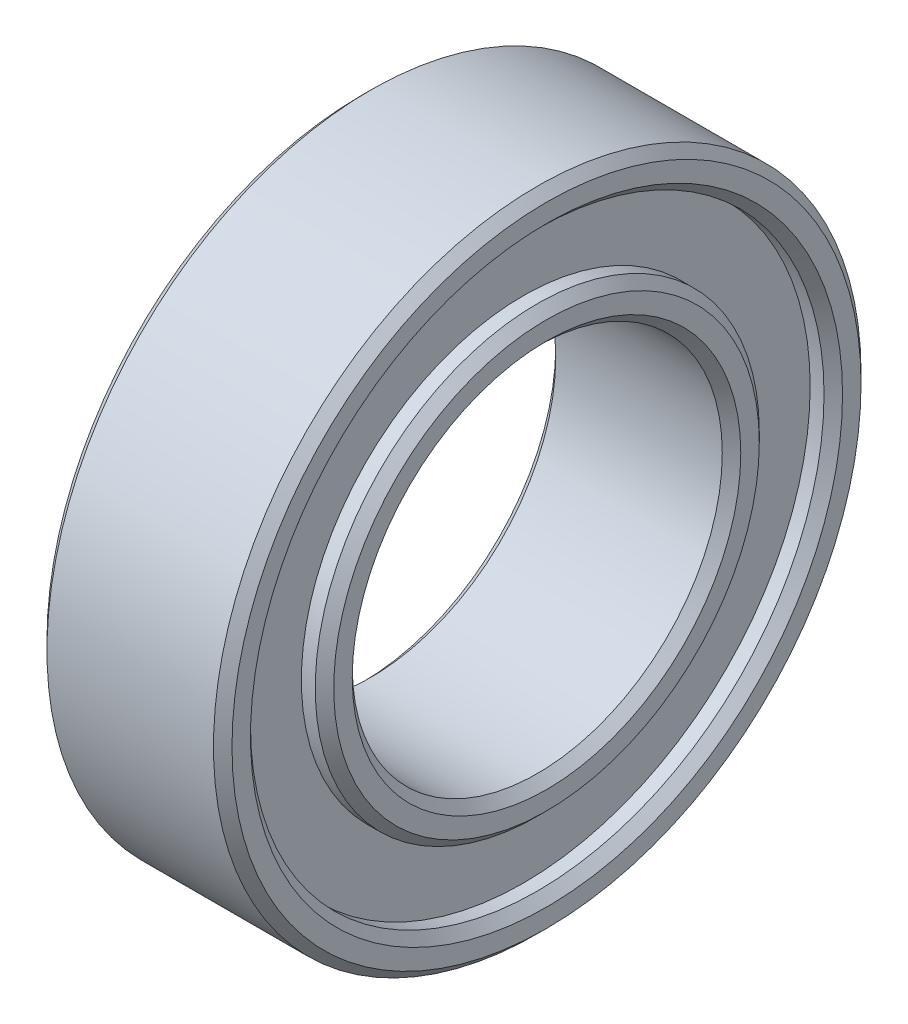
ISO-10303-21;
HEADER;
FILE_DESCRIPTION(('STEP AP214'),'2;1');
FILE_NAME('part.step','',(''),(''),'','','');
FILE_SCHEMA(('AUTOMOTIVE_DESIGN { 1 0 10303 214 1 1 1 1 }'));
ENDSEC;
DATA;
#1=APPLICATION_CONTEXT('core data for automotive mechanical design processes');
#2=APPLICATION_PROTOCOL_DEFINITION('international standard','automotive_design',2000,#1);
#3=PRODUCT_CONTEXT('',#1,'mechanical');
#4=PRODUCT('Part','Part','',(#3));
#5=PRODUCT_RELATED_PRODUCT_CATEGORY('part','',(#4));
#6=PRODUCT_DEFINITION_FORMATION('','',#4);
#7=PRODUCT_DEFINITION_CONTEXT('part definition',#1,'design');
#8=PRODUCT_DEFINITION('design','',#6,#7);
#9=PRODUCT_DEFINITION_SHAPE('','',#8);
#10=(LENGTH_UNIT() NAMED_UNIT(*) SI_UNIT(.MILLI.,.METRE.));
#11=(NAMED_UNIT(*) PLANE_ANGLE_UNIT() SI_UNIT($,.RADIAN.));
#12=(NAMED_UNIT(*) SI_UNIT($,.STERADIAN.) SOLID_ANGLE_UNIT());
#13=UNCERTAINTY_MEASURE_WITH_UNIT(LENGTH_MEASURE(1.E-05),#10,'distance_accuracy_value','');
#14=(GEOMETRIC_REPRESENTATION_CONTEXT(3) GLOBAL_UNCERTAINTY_ASSIGNED_CONTEXT((#13)) GLOBAL_UNIT_ASSIGNED_CONTEXT((#10,
#11,#12)) REPRESENTATION_CONTEXT('',''));
#15=CARTESIAN_POINT('',(0.,0.,0.));
#16=DIRECTION('',(0.,0.,1.));
#17=DIRECTION('',(1.,0.,0.));
#18=AXIS2_PLACEMENT_3D('',#15,#16,#17);
#19=CARTESIAN_POINT('',(-2.,0.,0.));
#20=DIRECTION('',(1.,0.,0.));
#21=DIRECTION('',(0.,0.,-1.));
#22=AXIS2_PLACEMENT_3D('',#19,#20,#21);
#23=PLANE('',#22);
#24=CARTESIAN_POINT('',(-2.,0.,0.));
#25=DIRECTION('',(1.,0.,0.));
#26=DIRECTION('',(0.,0.,-1.));
#27=AXIS2_PLACEMENT_3D('',#24,#25,#26);
#28=CIRCLE('',#27,4.6);
#29=CARTESIAN_POINT('',(-2.,0.,-4.6));
#30=VERTEX_POINT('',#29);
#31=EDGE_CURVE('E102',#30,#30,#28,.F.);
#32=ORIENTED_EDGE('',*,*,#31,.T.);
#33=EDGE_LOOP('',(#32));
#34=FACE_BOUND('',#33,.T.);
#35=CARTESIAN_POINT('',(-2.,0.,0.));
#36=DIRECTION('',(1.,0.,0.));
#37=DIRECTION('',(0.,0.,-1.));
#38=AXIS2_PLACEMENT_3D('',#35,#36,#37);
#39=CIRCLE('',#38,4.2);
#40=CARTESIAN_POINT('',(-2.,0.,-4.2));
#41=VERTEX_POINT('',#40);
#42=EDGE_CURVE('E106',#41,#41,#39,.T.);
#43=ORIENTED_EDGE('',*,*,#42,.T.);
#44=EDGE_LOOP('',(#43));
#45=FACE_BOUND('',#44,.T.);
#46=ADVANCED_FACE('F41',(#34,#45),#23,.F.);
#47=CARTESIAN_POINT('',(2.,0.,0.));
#48=DIRECTION('',(1.,0.,0.));
#49=DIRECTION('',(0.,0.,-1.));
#50=AXIS2_PLACEMENT_3D('',#47,#48,#49);
#51=PLANE('',#50);
#52=CARTESIAN_POINT('',(2.,0.,0.));
#53=DIRECTION('',(1.,0.,0.));
#54=DIRECTION('',(0.,0.,-1.));
#55=AXIS2_PLACEMENT_3D('',#52,#53,#54);
#56=CIRCLE('',#55,4.6);
#57=CARTESIAN_POINT('',(2.,0.,-4.6));
#58=VERTEX_POINT('',#57);
#59=EDGE_CURVE('E66',#58,#58,#56,.T.);
#60=ORIENTED_EDGE('',*,*,#59,.T.);
#61=EDGE_LOOP('',(#60));
#62=FACE_BOUND('',#61,.T.);
#63=CARTESIAN_POINT('',(2.,0.,0.));
#64=DIRECTION('',(1.,0.,0.));
#65=DIRECTION('',(0.,0.,-1.));
#66=AXIS2_PLACEMENT_3D('',#63,#64,#65);
#67=CIRCLE('',#66,4.2);
#68=CARTESIAN_POINT('',(2.,0.,-4.2));
#69=VERTEX_POINT('',#68);
#70=EDGE_CURVE('E70',#69,#69,#67,.F.);
#71=ORIENTED_EDGE('',*,*,#70,.T.);
#72=EDGE_LOOP('',(#71));
#73=FACE_BOUND('',#72,.T.);
#74=ADVANCED_FACE('F150',(#62,#73),#51,.T.);
#75=CARTESIAN_POINT('',(2.,0.,0.));
#76=DIRECTION('',(1.,0.,0.));
#77=DIRECTION('',(0.,0.,-1.));
#78=AXIS2_PLACEMENT_3D('',#75,#76,#77);
#79=CIRCLE('',#78,6.8);
#80=CARTESIAN_POINT('',(2.,0.,-6.8));
#81=VERTEX_POINT('',#80);
#82=EDGE_CURVE('E50',#81,#81,#79,.T.);
#83=ORIENTED_EDGE('',*,*,#82,.T.);
#84=EDGE_LOOP('',(#83));
#85=FACE_BOUND('',#84,.T.);
#86=CARTESIAN_POINT('',(2.,0.,0.));
#87=DIRECTION('',(1.,0.,0.));
#88=DIRECTION('',(0.,0.,-1.));
#89=AXIS2_PLACEMENT_3D('',#86,#87,#88);
#90=CIRCLE('',#89,6.4);
#91=CARTESIAN_POINT('',(2.,0.,-6.4));
#92=VERTEX_POINT('',#91);
#93=EDGE_CURVE('E55',#92,#92,#90,.F.);
#94=ORIENTED_EDGE('',*,*,#93,.T.);
#95=EDGE_LOOP('',(#94));
#96=FACE_BOUND('',#95,.T.);
#97=ADVANCED_FACE('F157',(#85,#96),#51,.T.);
#98=CARTESIAN_POINT('',(-2.,0.,0.));
#99=DIRECTION('',(1.,0.,0.));
#100=DIRECTION('',(0.,0.,-1.));
#101=AXIS2_PLACEMENT_3D('',#98,#99,#100);
#102=CIRCLE('',#101,6.8);
#103=CARTESIAN_POINT('',(-2.,0.,-6.8));
#104=VERTEX_POINT('',#103);
#105=EDGE_CURVE('E78',#104,#104,#102,.F.);
#106=ORIENTED_EDGE('',*,*,#105,.T.);
#107=EDGE_LOOP('',(#106));
#108=FACE_BOUND('',#107,.T.);
#109=CARTESIAN_POINT('',(-2.,0.,0.));
#110=DIRECTION('',(1.,0.,0.));
#111=DIRECTION('',(0.,0.,-1.));
#112=AXIS2_PLACEMENT_3D('',#109,#110,#111);
#113=CIRCLE('',#112,6.4);
#114=CARTESIAN_POINT('',(-2.,0.,-6.4));
#115=VERTEX_POINT('',#114);
#116=EDGE_CURVE('E82',#115,#115,#113,.T.);
#117=ORIENTED_EDGE('',*,*,#116,.T.);
#118=EDGE_LOOP('',(#117));
#119=FACE_BOUND('',#118,.T.);
#120=ADVANCED_FACE('F153',(#108,#119),#23,.F.);
#121=CARTESIAN_POINT('',(2.,0.,0.));
#122=DIRECTION('',(-1.,0.,0.));
#123=DIRECTION('',(0.,0.,1.));
#124=AXIS2_PLACEMENT_3D('',#121,#122,#123);
#125=CYLINDRICAL_SURFACE('',#124,7.);
#126=CARTESIAN_POINT('',(-1.8,0.,0.));
#127=DIRECTION('',(1.,0.,0.));
#128=DIRECTION('',(0.,0.,-1.));
#129=AXIS2_PLACEMENT_3D('',#126,#127,#128);
#130=CIRCLE('',#129,7.);
#131=CARTESIAN_POINT('',(-1.8,0.,-7.));
#132=VERTEX_POINT('',#131);
#133=EDGE_CURVE('E86',#132,#132,#130,.T.);
#134=ORIENTED_EDGE('',*,*,#133,.T.);
#135=EDGE_LOOP('',(#134));
#136=FACE_BOUND('',#135,.T.);
#137=CARTESIAN_POINT('',(1.8,0.,0.));
#138=DIRECTION('',(1.,0.,0.));
#139=DIRECTION('',(0.,0.,-1.));
#140=AXIS2_PLACEMENT_3D('',#137,#138,#139);
#141=CIRCLE('',#140,7.);
#142=CARTESIAN_POINT('',(1.8,0.,-7.));
#143=VERTEX_POINT('',#142);
#144=EDGE_CURVE('E90',#143,#143,#141,.F.);
#145=ORIENTED_EDGE('',*,*,#144,.T.);
#146=EDGE_LOOP('',(#145));
#147=FACE_BOUND('',#146,.T.);
#148=ADVANCED_FACE('F163',(#136,#147),#125,.T.);
#149=CARTESIAN_POINT('',(2.,0.,0.));
#150=DIRECTION('',(-1.,0.,0.));
#151=DIRECTION('',(0.,0.,1.));
#152=AXIS2_PLACEMENT_3D('',#149,#150,#151);
#153=CYLINDRICAL_SURFACE('',#152,4.);
#154=CARTESIAN_POINT('',(-1.8,0.,0.));
#155=DIRECTION('',(1.,0.,0.));
#156=DIRECTION('',(0.,0.,-1.));
#157=AXIS2_PLACEMENT_3D('',#154,#155,#156);
#158=CIRCLE('',#157,4.);
#159=CARTESIAN_POINT('',(-1.8,0.,-4.));
#160=VERTEX_POINT('',#159);
#161=EDGE_CURVE('E94',#160,#160,#158,.F.);
#162=ORIENTED_EDGE('',*,*,#161,.T.);
#163=EDGE_LOOP('',(#162));
#164=FACE_BOUND('',#163,.T.);
#165=CARTESIAN_POINT('',(1.8,0.,0.));
#166=DIRECTION('',(1.,0.,0.));
#167=DIRECTION('',(0.,0.,-1.));
#168=AXIS2_PLACEMENT_3D('',#165,#166,#167);
#169=CIRCLE('',#168,4.);
#170=CARTESIAN_POINT('',(1.8,0.,-4.));
#171=VERTEX_POINT('',#170);
#172=EDGE_CURVE('E98',#171,#171,#169,.T.);
#173=ORIENTED_EDGE('',*,*,#172,.T.);
#174=EDGE_LOOP('',(#173));
#175=FACE_BOUND('',#174,.T.);
#176=ADVANCED_FACE('F169',(#164,#175),#153,.F.);
#177=CARTESIAN_POINT('',(1.5,0.,0.));
#178=DIRECTION('',(1.,0.,0.));
#179=DIRECTION('',(0.,0.,-1.));
#180=AXIS2_PLACEMENT_3D('',#177,#178,#179);
#181=CYLINDRICAL_SURFACE('',#180,6.2);
#182=CARTESIAN_POINT('',(1.8,0.,0.));
#183=DIRECTION('',(1.,0.,0.));
#184=DIRECTION('',(0.,0.,-1.));
#185=AXIS2_PLACEMENT_3D('',#182,#183,#184);
#186=CIRCLE('',#185,6.2);
#187=CARTESIAN_POINT('',(1.8,0.,-6.2));
#188=VERTEX_POINT('',#187);
#189=EDGE_CURVE('E10',#188,#188,#186,.T.);
#190=ORIENTED_EDGE('',*,*,#189,.T.);
#191=EDGE_LOOP('',(#190));
#192=FACE_BOUND('',#191,.T.);
#193=CARTESIAN_POINT('',(1.5,0.,0.));
#194=DIRECTION('',(1.,0.,0.));
#195=DIRECTION('',(0.,0.,-1.));
#196=AXIS2_PLACEMENT_3D('',#193,#194,#195);
#197=CIRCLE('',#196,6.2);
#198=CARTESIAN_POINT('',(1.5,0.,-6.2));
#199=VERTEX_POINT('',#198);
#200=EDGE_CURVE('E114',#199,#199,#197,.T.);
#201=ORIENTED_EDGE('',*,*,#200,.F.);
#202=EDGE_LOOP('',(#201));
#203=FACE_BOUND('',#202,.T.);
#204=ADVANCED_FACE('F298',(#192,#203),#181,.F.);
#205=CARTESIAN_POINT('',(1.5,0.,0.));
#206=DIRECTION('',(1.,0.,0.));
#207=DIRECTION('',(0.,0.,-1.));
#208=AXIS2_PLACEMENT_3D('',#205,#206,#207);
#209=PLANE('',#208);
#210=CARTESIAN_POINT('',(1.5,0.,0.));
#211=DIRECTION('',(1.,0.,0.));
#212=DIRECTION('',(0.,0.,-1.));
#213=AXIS2_PLACEMENT_3D('',#210,#211,#212);
#214=CIRCLE('',#213,4.8);
#215=CARTESIAN_POINT('',(1.5,0.,-4.8));
#216=VERTEX_POINT('',#215);
#217=EDGE_CURVE('E118',#216,#216,#214,.T.);
#218=ORIENTED_EDGE('',*,*,#217,.F.);
#219=EDGE_LOOP('',(#218));
#220=FACE_BOUND('',#219,.T.);
#221=ORIENTED_EDGE('',*,*,#200,.T.);
#222=EDGE_LOOP('',(#221));
#223=FACE_BOUND('',#222,.T.);
#224=ADVANCED_FACE('F288',(#220,#223),#209,.T.);
#225=CARTESIAN_POINT('',(1.5,0.,0.));
#226=DIRECTION('',(1.,0.,0.));
#227=DIRECTION('',(0.,0.,-1.));
#228=AXIS2_PLACEMENT_3D('',#225,#226,#227);
#229=CYLINDRICAL_SURFACE('',#228,4.8);
#230=CARTESIAN_POINT('',(1.8,0.,0.));
#231=DIRECTION('',(1.,0.,0.));
#232=DIRECTION('',(0.,0.,-1.));
#233=AXIS2_PLACEMENT_3D('',#230,#231,#232);
#234=CIRCLE('',#233,4.8);
#235=CARTESIAN_POINT('',(1.8,0.,-4.8));
#236=VERTEX_POINT('',#235);
#237=EDGE_CURVE('E60',#236,#236,#234,.F.);
#238=ORIENTED_EDGE('',*,*,#237,.T.);
#239=EDGE_LOOP('',(#238));
#240=FACE_BOUND('',#239,.T.);
#241=ORIENTED_EDGE('',*,*,#217,.T.);
#242=EDGE_LOOP('',(#241));
#243=FACE_BOUND('',#242,.T.);
#244=ADVANCED_FACE('F283',(#240,#243),#229,.T.);
#245=CARTESIAN_POINT('',(-1.5,0.,0.));
#246=DIRECTION('',(-1.,0.,0.));
#247=DIRECTION('',(0.,0.,-1.));
#248=AXIS2_PLACEMENT_3D('',#245,#246,#247);
#249=PLANE('',#248);
#250=CARTESIAN_POINT('',(-1.5,0.,0.));
#251=DIRECTION('',(1.,0.,0.));
#252=DIRECTION('',(0.,0.,-1.));
#253=AXIS2_PLACEMENT_3D('',#250,#251,#252);
#254=CIRCLE('',#253,6.2);
#255=CARTESIAN_POINT('',(-1.5,0.,-6.2));
#256=VERTEX_POINT('',#255);
#257=EDGE_CURVE('E122',#256,#256,#254,.T.);
#258=ORIENTED_EDGE('',*,*,#257,.F.);
#259=EDGE_LOOP('',(#258));
#260=FACE_BOUND('',#259,.T.);
#261=CARTESIAN_POINT('',(-1.5,0.,0.));
#262=DIRECTION('',(1.,0.,0.));
#263=DIRECTION('',(0.,0.,-1.));
#264=AXIS2_PLACEMENT_3D('',#261,#262,#263);
#265=CIRCLE('',#264,4.8);
#266=CARTESIAN_POINT('',(-1.5,0.,-4.8));
#267=VERTEX_POINT('',#266);
#268=EDGE_CURVE('E126',#267,#267,#265,.T.);
#269=ORIENTED_EDGE('',*,*,#268,.T.);
#270=EDGE_LOOP('',(#269));
#271=FACE_BOUND('',#270,.T.);
#272=ADVANCED_FACE('F131',(#260,#271),#249,.T.);
#273=CARTESIAN_POINT('',(-1.5,0.,0.));
#274=DIRECTION('',(-1.,0.,0.));
#275=DIRECTION('',(0.,0.,1.));
#276=AXIS2_PLACEMENT_3D('',#273,#274,#275);
#277=CYLINDRICAL_SURFACE('',#276,6.2);
#278=CARTESIAN_POINT('',(-1.8,0.,0.));
#279=DIRECTION('',(1.,0.,0.));
#280=DIRECTION('',(0.,0.,-1.));
#281=AXIS2_PLACEMENT_3D('',#278,#279,#280);
#282=CIRCLE('',#281,6.2);
#283=CARTESIAN_POINT('',(-1.8,0.,-6.2));
#284=VERTEX_POINT('',#283);
#285=EDGE_CURVE('E74',#284,#284,#282,.F.);
#286=ORIENTED_EDGE('',*,*,#285,.T.);
#287=EDGE_LOOP('',(#286));
#288=FACE_BOUND('',#287,.T.);
#289=ORIENTED_EDGE('',*,*,#257,.T.);
#290=EDGE_LOOP('',(#289));
#291=FACE_BOUND('',#290,.T.);
#292=ADVANCED_FACE('F136',(#288,#291),#277,.F.);
#293=CARTESIAN_POINT('',(-1.5,0.,0.));
#294=DIRECTION('',(-1.,0.,0.));
#295=DIRECTION('',(0.,0.,1.));
#296=AXIS2_PLACEMENT_3D('',#293,#294,#295);
#297=CYLINDRICAL_SURFACE('',#296,4.8);
#298=CARTESIAN_POINT('',(-1.8,0.,0.));
#299=DIRECTION('',(1.,0.,0.));
#300=DIRECTION('',(0.,0.,-1.));
#301=AXIS2_PLACEMENT_3D('',#298,#299,#300);
#302=CIRCLE('',#301,4.8);
#303=CARTESIAN_POINT('',(-1.8,0.,-4.8));
#304=VERTEX_POINT('',#303);
#305=EDGE_CURVE('E110',#304,#304,#302,.T.);
#306=ORIENTED_EDGE('',*,*,#305,.T.);
#307=EDGE_LOOP('',(#306));
#308=FACE_BOUND('',#307,.T.);
#309=ORIENTED_EDGE('',*,*,#268,.F.);
#310=EDGE_LOOP('',(#309));
#311=FACE_BOUND('',#310,.T.);
#312=ADVANCED_FACE('F133',(#308,#311),#297,.T.);
#313=CARTESIAN_POINT('',(-1.8,0.,0.));
#314=DIRECTION('',(1.,0.,0.));
#315=DIRECTION('',(0.,0.,-1.));
#316=AXIS2_PLACEMENT_3D('',#313,#314,#315);
#317=CONICAL_SURFACE('',#316,4.8,0.78539816339745);
#318=ORIENTED_EDGE('',*,*,#31,.F.);
#319=EDGE_LOOP('',(#318));
#320=FACE_BOUND('',#319,.T.);
#321=ORIENTED_EDGE('',*,*,#305,.F.);
#322=EDGE_LOOP('',(#321));
#323=FACE_BOUND('',#322,.T.);
#324=ADVANCED_FACE('F135',(#320,#323),#317,.T.);
#325=CARTESIAN_POINT('',(-2.,0.,0.));
#326=DIRECTION('',(-1.,0.,0.));
#327=DIRECTION('',(0.,0.,1.));
#328=AXIS2_PLACEMENT_3D('',#325,#326,#327);
#329=CONICAL_SURFACE('',#328,4.2,0.785398163397444);
#330=ORIENTED_EDGE('',*,*,#161,.F.);
#331=EDGE_LOOP('',(#330));
#332=FACE_BOUND('',#331,.T.);
#333=ORIENTED_EDGE('',*,*,#42,.F.);
#334=EDGE_LOOP('',(#333));
#335=FACE_BOUND('',#334,.T.);
#336=ADVANCED_FACE('F143',(#332,#335),#329,.F.);
#337=CARTESIAN_POINT('',(-1.8,0.,0.));
#338=DIRECTION('',(1.,0.,0.));
#339=DIRECTION('',(0.,0.,-1.));
#340=AXIS2_PLACEMENT_3D('',#337,#338,#339);
#341=CONICAL_SURFACE('',#340,7.,0.785398163397453);
#342=ORIENTED_EDGE('',*,*,#105,.F.);
#343=EDGE_LOOP('',(#342));
#344=FACE_BOUND('',#343,.T.);
#345=ORIENTED_EDGE('',*,*,#133,.F.);
#346=EDGE_LOOP('',(#345));
#347=FACE_BOUND('',#346,.T.);
#348=ADVANCED_FACE('F178',(#344,#347),#341,.T.);
#349=CARTESIAN_POINT('',(-2.,0.,0.));
#350=DIRECTION('',(-1.,0.,0.));
#351=DIRECTION('',(0.,0.,1.));
#352=AXIS2_PLACEMENT_3D('',#349,#350,#351);
#353=CONICAL_SURFACE('',#352,6.4,0.785398163397446);
#354=ORIENTED_EDGE('',*,*,#285,.F.);
#355=EDGE_LOOP('',(#354));
#356=FACE_BOUND('',#355,.T.);
#357=ORIENTED_EDGE('',*,*,#116,.F.);
#358=EDGE_LOOP('',(#357));
#359=FACE_BOUND('',#358,.T.);
#360=ADVANCED_FACE('F175',(#356,#359),#353,.F.);
#361=CARTESIAN_POINT('',(2.,0.,0.));
#362=DIRECTION('',(-1.,0.,0.));
#363=DIRECTION('',(0.,0.,1.));
#364=AXIS2_PLACEMENT_3D('',#361,#362,#363);
#365=CONICAL_SURFACE('',#364,4.6,0.78539816339745);
#366=ORIENTED_EDGE('',*,*,#237,.F.);
#367=EDGE_LOOP('',(#366));
#368=FACE_BOUND('',#367,.T.);
#369=ORIENTED_EDGE('',*,*,#59,.F.);
#370=EDGE_LOOP('',(#369));
#371=FACE_BOUND('',#370,.T.);
#372=ADVANCED_FACE('F177',(#368,#371),#365,.T.);
#373=CARTESIAN_POINT('',(1.8,0.,0.));
#374=DIRECTION('',(1.,0.,0.));
#375=DIRECTION('',(0.,0.,-1.));
#376=AXIS2_PLACEMENT_3D('',#373,#374,#375);
#377=CONICAL_SURFACE('',#376,4.,0.785398163397455);
#378=ORIENTED_EDGE('',*,*,#70,.F.);
#379=EDGE_LOOP('',(#378));
#380=FACE_BOUND('',#379,.T.);
#381=ORIENTED_EDGE('',*,*,#172,.F.);
#382=EDGE_LOOP('',(#381));
#383=FACE_BOUND('',#382,.T.);
#384=ADVANCED_FACE('F185',(#380,#383),#377,.F.);
#385=CARTESIAN_POINT('',(2.,0.,0.));
#386=DIRECTION('',(-1.,0.,0.));
#387=DIRECTION('',(0.,0.,1.));
#388=AXIS2_PLACEMENT_3D('',#385,#386,#387);
#389=CONICAL_SURFACE('',#388,6.8,0.785398163397446);
#390=ORIENTED_EDGE('',*,*,#144,.F.);
#391=EDGE_LOOP('',(#390));
#392=FACE_BOUND('',#391,.T.);
#393=ORIENTED_EDGE('',*,*,#82,.F.);
#394=EDGE_LOOP('',(#393));
#395=FACE_BOUND('',#394,.T.);
#396=ADVANCED_FACE('F205',(#392,#395),#389,.T.);
#397=CARTESIAN_POINT('',(1.8,0.,0.));
#398=DIRECTION('',(1.,0.,0.));
#399=DIRECTION('',(0.,0.,-1.));
#400=AXIS2_PLACEMENT_3D('',#397,#398,#399);
#401=CONICAL_SURFACE('',#400,6.2,0.785398163397444);
#402=CARTESIAN_POINT('',(2.,0.,-6.4));
#403=CARTESIAN_POINT('',(1.99791666666667,0.,-6.39791666666666));
#404=CARTESIAN_POINT('',(1.99583333333333,0.,-6.39583333333333));
#405=CARTESIAN_POINT('',(1.99166666666667,0.,-6.39166666666666));
#406=CARTESIAN_POINT('',(1.98958333333333,0.,-6.38958333333333));
#407=CARTESIAN_POINT('',(1.98541666666667,0.,-6.38541666666666));
#408=CARTESIAN_POINT('',(1.98333333333333,0.,-6.38333333333333));
#409=CARTESIAN_POINT('',(1.97916666666667,0.,-6.37916666666666));
#410=CARTESIAN_POINT('',(1.97708333333333,0.,-6.37708333333333));
#411=CARTESIAN_POINT('',(1.97291666666667,0.,-6.37291666666666));
#412=CARTESIAN_POINT('',(1.97083333333333,0.,-6.37083333333333));
#413=CARTESIAN_POINT('',(1.96666666666667,0.,-6.36666666666666));
#414=CARTESIAN_POINT('',(1.96458333333333,0.,-6.36458333333333));
#415=CARTESIAN_POINT('',(1.96041666666667,0.,-6.36041666666666));
#416=CARTESIAN_POINT('',(1.95833333333333,0.,-6.35833333333333));
#417=CARTESIAN_POINT('',(1.95416666666667,0.,-6.35416666666666));
#418=CARTESIAN_POINT('',(1.95208333333333,0.,-6.35208333333333));
#419=CARTESIAN_POINT('',(1.94791666666667,0.,-6.34791666666666));
#420=CARTESIAN_POINT('',(1.94583333333333,0.,-6.34583333333333));
#421=CARTESIAN_POINT('',(1.94166666666667,0.,-6.34166666666666));
#422=CARTESIAN_POINT('',(1.93958333333333,0.,-6.33958333333333));
#423=CARTESIAN_POINT('',(1.93541666666667,0.,-6.33541666666666));
#424=CARTESIAN_POINT('',(1.93333333333333,0.,-6.33333333333333));
#425=CARTESIAN_POINT('',(1.92916666666667,0.,-6.32916666666666));
#426=CARTESIAN_POINT('',(1.92708333333333,0.,-6.32708333333333));
#427=CARTESIAN_POINT('',(1.92291666666667,0.,-6.32291666666666));
#428=CARTESIAN_POINT('',(1.92083333333333,0.,-6.32083333333333));
#429=CARTESIAN_POINT('',(1.91666666666667,0.,-6.31666666666666));
#430=CARTESIAN_POINT('',(1.91458333333333,0.,-6.31458333333333));
#431=CARTESIAN_POINT('',(1.91041666666667,0.,-6.31041666666667));
#432=CARTESIAN_POINT('',(1.90833333333333,0.,-6.30833333333333));
#433=CARTESIAN_POINT('',(1.90416666666667,0.,-6.30416666666666));
#434=CARTESIAN_POINT('',(1.90208333333333,0.,-6.30208333333333));
#435=CARTESIAN_POINT('',(1.89791666666667,0.,-6.29791666666666));
#436=CARTESIAN_POINT('',(1.89583333333333,0.,-6.29583333333333));
#437=CARTESIAN_POINT('',(1.89166666666667,0.,-6.29166666666667));
#438=CARTESIAN_POINT('',(1.88958333333333,0.,-6.28958333333333));
#439=CARTESIAN_POINT('',(1.88541666666667,0.,-6.28541666666666));
#440=CARTESIAN_POINT('',(1.88333333333333,0.,-6.28333333333333));
#441=CARTESIAN_POINT('',(1.87916666666667,0.,-6.27916666666667));
#442=CARTESIAN_POINT('',(1.87708333333333,0.,-6.27708333333333));
#443=CARTESIAN_POINT('',(1.87291666666667,0.,-6.27291666666666));
#444=CARTESIAN_POINT('',(1.87083333333333,0.,-6.27083333333333));
#445=CARTESIAN_POINT('',(1.86666666666667,0.,-6.26666666666666));
#446=CARTESIAN_POINT('',(1.86458333333333,0.,-6.26458333333333));
#447=CARTESIAN_POINT('',(1.86041666666667,0.,-6.26041666666667));
#448=CARTESIAN_POINT('',(1.85833333333333,0.,-6.25833333333333));
#449=CARTESIAN_POINT('',(1.85416666666667,0.,-6.25416666666666));
#450=CARTESIAN_POINT('',(1.85208333333333,0.,-6.25208333333333));
#451=CARTESIAN_POINT('',(1.84791666666667,0.,-6.24791666666667));
#452=CARTESIAN_POINT('',(1.84583333333333,0.,-6.24583333333333));
#453=CARTESIAN_POINT('',(1.84166666666667,0.,-6.24166666666667));
#454=CARTESIAN_POINT('',(1.83958333333333,0.,-6.23958333333333));
#455=CARTESIAN_POINT('',(1.83541666666667,0.,-6.23541666666666));
#456=CARTESIAN_POINT('',(1.83333333333333,0.,-6.23333333333333));
#457=CARTESIAN_POINT('',(1.82916666666667,0.,-6.22916666666667));
#458=CARTESIAN_POINT('',(1.82708333333333,0.,-6.22708333333333));
#459=CARTESIAN_POINT('',(1.82291666666667,0.,-6.22291666666667));
#460=CARTESIAN_POINT('',(1.82083333333333,0.,-6.22083333333333));
#461=CARTESIAN_POINT('',(1.81666666666667,0.,-6.21666666666667));
#462=CARTESIAN_POINT('',(1.81458333333333,0.,-6.21458333333333));
#463=CARTESIAN_POINT('',(1.81041666666667,0.,-6.21041666666667));
#464=CARTESIAN_POINT('',(1.80833333333333,0.,-6.20833333333333));
#465=CARTESIAN_POINT('',(1.80416666666667,0.,-6.20416666666667));
#466=CARTESIAN_POINT('',(1.80208333333333,0.,-6.20208333333333));
#467=CARTESIAN_POINT('',(1.8,0.,-6.2));
#468=B_SPLINE_CURVE_WITH_KNOTS('',3,(#402,#403,#404,#405,#406,#407,#408,#409,#410,#411,#412,
#413,#414,#415,#416,#417,#418,#419,#420,#421,#422,#423,#424,#425,#426,#427,#428,#429,#430,#431,
#432,#433,#434,#435,#436,#437,#438,#439,#440,#441,#442,#443,#444,#445,#446,#447,#448,#449,#450,
#451,#452,#453,#454,#455,#456,#457,#458,#459,#460,#461,#462,#463,#464,#465,#466,#467),
.UNSPECIFIED.,.F.,.F.,(4,2,2,2,2,2,2,2,2,2,2,2,2,2,2,2,2,2,2,2,2,2,2,2,2,2,2,2,2,2,2,2,4),(0.,
0.00883883476483179,0.0176776695296639,0.0265165042944951,0.0353553390593272,0.044194173824159,
0.0530330085889911,0.0618718433538222,0.0707106781186543,0.0795495128834863,0.0883883476483176,
0.0972271824131496,0.106066017177981,0.114904851942814,0.123743686707645,0.132582521472477,
0.141421356237309,0.15026019100214,0.159099025766972,0.167937860531804,0.176776695296636,
0.185615530061467,0.194454364826299,0.203293199591131,0.212132034355963,0.220970869120795,
0.229809703885627,0.238648538650458,0.24748737341529,0.256326208180122,0.265165042944954,
0.274003877709785,0.282842712474617),.UNSPECIFIED.);
#469=EDGE_CURVE('BSEAM44',#92,#188,#468,.T.);
#470=ORIENTED_EDGE('',*,*,#93,.F.);
#471=ORIENTED_EDGE('',*,*,#189,.F.);
#472=ORIENTED_EDGE('',*,*,#469,.T.);
#473=ORIENTED_EDGE('',*,*,#469,.F.);
#474=EDGE_LOOP('',(#470,#472,#471,#473));
#475=FACE_BOUND('',#474,.T.);
#476=ADVANCED_FACE('F44',(#475),#401,.F.);
#477=CLOSED_SHELL('',(#46,#74,#97,#120,#148,#176,#204,#224,#244,#272,#292,#312,#324,#336,#348,
#360,#372,#384,#396,#476));
#478=MANIFOLD_SOLID_BREP('B2',#477);
#479=ADVANCED_BREP_SHAPE_REPRESENTATION('',(#18,#478),#14);
#480=SHAPE_DEFINITION_REPRESENTATION(#9,#479);
ENDSEC;
END-ISO-10303-21;
